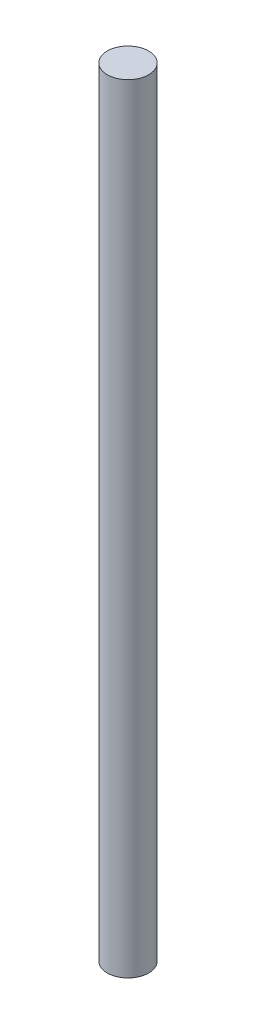
ISO-10303-21;
HEADER;
FILE_DESCRIPTION(('STEP AP214'),'2;1');
FILE_NAME('part.step','',(''),(''),'','','');
FILE_SCHEMA(('AUTOMOTIVE_DESIGN { 1 0 10303 214 1 1 1 1 }'));
ENDSEC;
DATA;
#1=APPLICATION_CONTEXT('core data for automotive mechanical design processes');
#2=APPLICATION_PROTOCOL_DEFINITION('international standard','automotive_design',2000,#1);
#3=PRODUCT_CONTEXT('',#1,'mechanical');
#4=PRODUCT('Part','Part','',(#3));
#5=PRODUCT_RELATED_PRODUCT_CATEGORY('part','',(#4));
#6=PRODUCT_DEFINITION_FORMATION('','',#4);
#7=PRODUCT_DEFINITION_CONTEXT('part definition',#1,'design');
#8=PRODUCT_DEFINITION('design','',#6,#7);
#9=PRODUCT_DEFINITION_SHAPE('','',#8);
#10=(LENGTH_UNIT() NAMED_UNIT(*) SI_UNIT(.MILLI.,.METRE.));
#11=(NAMED_UNIT(*) PLANE_ANGLE_UNIT() SI_UNIT($,.RADIAN.));
#12=(NAMED_UNIT(*) SI_UNIT($,.STERADIAN.) SOLID_ANGLE_UNIT());
#13=UNCERTAINTY_MEASURE_WITH_UNIT(LENGTH_MEASURE(1.E-05),#10,'distance_accuracy_value','');
#14=(GEOMETRIC_REPRESENTATION_CONTEXT(3) GLOBAL_UNCERTAINTY_ASSIGNED_CONTEXT((#13)) GLOBAL_UNIT_ASSIGNED_CONTEXT((#10,
#11,#12)) REPRESENTATION_CONTEXT('',''));
#15=CARTESIAN_POINT('',(0.,0.,0.));
#16=DIRECTION('',(0.,0.,1.));
#17=DIRECTION('',(1.,0.,0.));
#18=AXIS2_PLACEMENT_3D('',#15,#16,#17);
#19=CARTESIAN_POINT('',(3.,-56.5,0.));
#20=DIRECTION('',(0.,1.,0.));
#21=DIRECTION('',(0.,0.,1.));
#22=AXIS2_PLACEMENT_3D('',#19,#20,#21);
#23=PLANE('',#22);
#24=CARTESIAN_POINT('',(0.,-56.5,0.));
#25=DIRECTION('',(0.,1.,0.));
#26=DIRECTION('',(0.,0.,1.));
#27=AXIS2_PLACEMENT_3D('',#24,#25,#26);
#28=CIRCLE('',#27,3.);
#29=CARTESIAN_POINT('',(0.,-56.5,3.));
#30=VERTEX_POINT('',#29);
#31=EDGE_CURVE('E18',#30,#30,#28,.T.);
#32=ORIENTED_EDGE('',*,*,#31,.F.);
#33=EDGE_LOOP('',(#32));
#34=FACE_BOUND('',#33,.T.);
#35=ADVANCED_FACE('F15',(#34),#23,.F.);
#36=CARTESIAN_POINT('',(0.,56.5,0.));
#37=DIRECTION('',(0.,-1.,0.));
#38=DIRECTION('',(0.,0.,-1.));
#39=AXIS2_PLACEMENT_3D('',#36,#37,#38);
#40=PLANE('',#39);
#41=CARTESIAN_POINT('',(0.,56.5,0.));
#42=DIRECTION('',(0.,1.,0.));
#43=DIRECTION('',(0.,0.,1.));
#44=AXIS2_PLACEMENT_3D('',#41,#42,#43);
#45=CIRCLE('',#44,3.);
#46=CARTESIAN_POINT('',(0.,56.5,3.));
#47=VERTEX_POINT('',#46);
#48=EDGE_CURVE('E10',#47,#47,#45,.F.);
#49=ORIENTED_EDGE('',*,*,#48,.F.);
#50=EDGE_LOOP('',(#49));
#51=FACE_BOUND('',#50,.T.);
#52=ADVANCED_FACE('F30',(#51),#40,.F.);
#53=CARTESIAN_POINT('',(0.,-56.5,0.));
#54=DIRECTION('',(0.,1.,0.));
#55=DIRECTION('',(0.,0.,1.));
#56=AXIS2_PLACEMENT_3D('',#53,#54,#55);
#57=CYLINDRICAL_SURFACE('',#56,3.);
#58=ORIENTED_EDGE('',*,*,#48,.T.);
#59=EDGE_LOOP('',(#58));
#60=FACE_BOUND('',#59,.T.);
#61=ORIENTED_EDGE('',*,*,#31,.T.);
#62=EDGE_LOOP('',(#61));
#63=FACE_BOUND('',#62,.T.);
#64=ADVANCED_FACE('F27',(#60,#63),#57,.T.);
#65=CLOSED_SHELL('',(#35,#52,#64));
#66=MANIFOLD_SOLID_BREP('B1',#65);
#67=ADVANCED_BREP_SHAPE_REPRESENTATION('',(#18,#66),#14);
#68=SHAPE_DEFINITION_REPRESENTATION(#9,#67);
ENDSEC;
END-ISO-10303-21;
